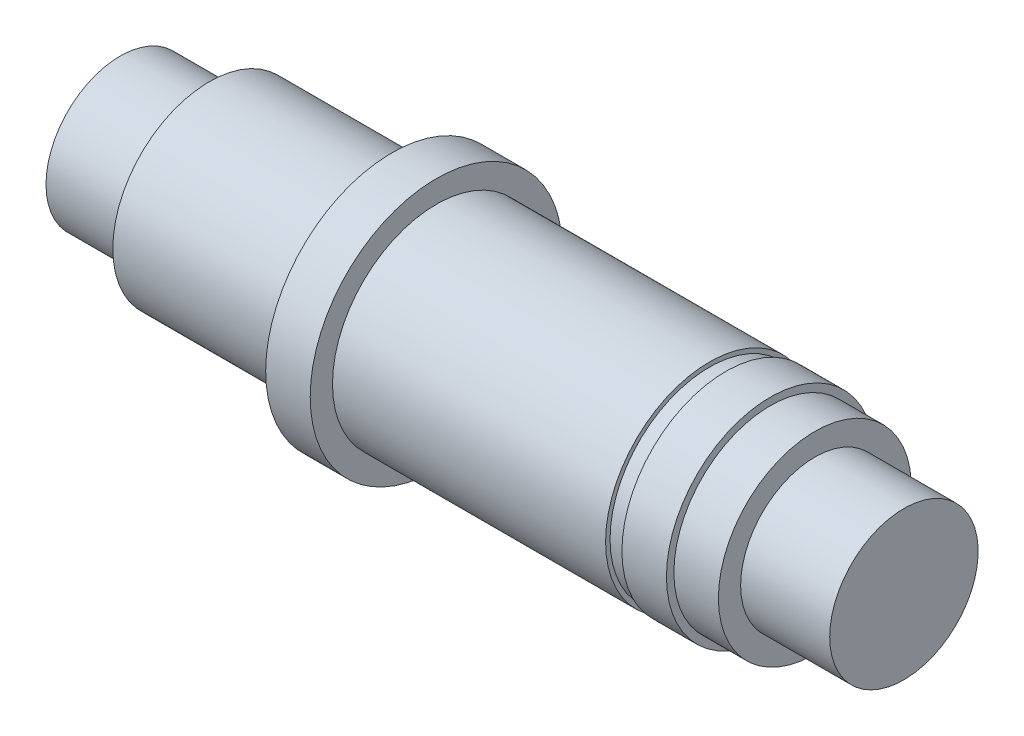
ISO-10303-21;
HEADER;
FILE_DESCRIPTION(('STEP AP214'),'2;1');
FILE_NAME('part.step','',(''),(''),'','','');
FILE_SCHEMA(('AUTOMOTIVE_DESIGN { 1 0 10303 214 1 1 1 1 }'));
ENDSEC;
DATA;
#1=APPLICATION_CONTEXT('core data for automotive mechanical design processes');
#2=APPLICATION_PROTOCOL_DEFINITION('international standard','automotive_design',2000,#1);
#3=PRODUCT_CONTEXT('',#1,'mechanical');
#4=PRODUCT('Part','Part','',(#3));
#5=PRODUCT_RELATED_PRODUCT_CATEGORY('part','',(#4));
#6=PRODUCT_DEFINITION_FORMATION('','',#4);
#7=PRODUCT_DEFINITION_CONTEXT('part definition',#1,'design');
#8=PRODUCT_DEFINITION('design','',#6,#7);
#9=PRODUCT_DEFINITION_SHAPE('','',#8);
#10=(LENGTH_UNIT() NAMED_UNIT(*) SI_UNIT(.MILLI.,.METRE.));
#11=(NAMED_UNIT(*) PLANE_ANGLE_UNIT() SI_UNIT($,.RADIAN.));
#12=(NAMED_UNIT(*) SI_UNIT($,.STERADIAN.) SOLID_ANGLE_UNIT());
#13=UNCERTAINTY_MEASURE_WITH_UNIT(LENGTH_MEASURE(1.E-05),#10,'distance_accuracy_value','');
#14=(GEOMETRIC_REPRESENTATION_CONTEXT(3) GLOBAL_UNCERTAINTY_ASSIGNED_CONTEXT((#13)) GLOBAL_UNIT_ASSIGNED_CONTEXT((#10,
#11,#12)) REPRESENTATION_CONTEXT('',''));
#15=CARTESIAN_POINT('',(0.,0.,0.));
#16=DIRECTION('',(0.,0.,1.));
#17=DIRECTION('',(1.,0.,0.));
#18=AXIS2_PLACEMENT_3D('',#15,#16,#17);
#19=CARTESIAN_POINT('',(46.8,0.,0.));
#20=DIRECTION('',(1.,0.,0.));
#21=DIRECTION('',(0.,0.,-1.));
#22=AXIS2_PLACEMENT_3D('',#19,#20,#21);
#23=PLANE('',#22);
#24=CARTESIAN_POINT('',(46.8,0.,0.));
#25=DIRECTION('',(-1.,0.,0.));
#26=DIRECTION('',(0.,0.,1.));
#27=AXIS2_PLACEMENT_3D('',#24,#25,#26);
#28=CIRCLE('',#27,5.);
#29=CARTESIAN_POINT('',(46.8,0.,5.));
#30=VERTEX_POINT('',#29);
#31=EDGE_CURVE('E98',#30,#30,#28,.T.);
#32=ORIENTED_EDGE('',*,*,#31,.T.);
#33=EDGE_LOOP('',(#32));
#34=FACE_BOUND('',#33,.T.);
#35=CARTESIAN_POINT('',(46.8,0.,0.));
#36=DIRECTION('',(-1.,0.,0.));
#37=DIRECTION('',(0.,0.,1.));
#38=AXIS2_PLACEMENT_3D('',#35,#36,#37);
#39=CIRCLE('',#38,6.5);
#40=CARTESIAN_POINT('',(46.8,0.,6.5));
#41=VERTEX_POINT('',#40);
#42=EDGE_CURVE('E12',#41,#41,#39,.T.);
#43=ORIENTED_EDGE('',*,*,#42,.F.);
#44=EDGE_LOOP('',(#43));
#45=FACE_BOUND('',#44,.T.);
#46=ADVANCED_FACE('F46',(#34,#45),#23,.T.);
#47=CARTESIAN_POINT('',(-13.6685201218921,0.,0.));
#48=DIRECTION('',(-1.,0.,0.));
#49=DIRECTION('',(0.,0.,1.));
#50=AXIS2_PLACEMENT_3D('',#47,#48,#49);
#51=CYLINDRICAL_SURFACE('',#50,6.5);
#52=ORIENTED_EDGE('',*,*,#42,.T.);
#53=EDGE_LOOP('',(#52));
#54=FACE_BOUND('',#53,.T.);
#55=CARTESIAN_POINT('',(43.8,0.,0.));
#56=DIRECTION('',(-1.,0.,0.));
#57=DIRECTION('',(0.,0.,1.));
#58=AXIS2_PLACEMENT_3D('',#55,#56,#57);
#59=CIRCLE('',#58,6.5);
#60=CARTESIAN_POINT('',(43.8,0.,6.5));
#61=VERTEX_POINT('',#60);
#62=EDGE_CURVE('E52',#61,#61,#59,.T.);
#63=ORIENTED_EDGE('',*,*,#62,.F.);
#64=EDGE_LOOP('',(#63));
#65=FACE_BOUND('',#64,.T.);
#66=ADVANCED_FACE('F116',(#54,#65),#51,.T.);
#67=CARTESIAN_POINT('',(43.8,0.,0.));
#68=DIRECTION('',(1.,0.,0.));
#69=DIRECTION('',(0.,0.,-1.));
#70=AXIS2_PLACEMENT_3D('',#67,#68,#69);
#71=PLANE('',#70);
#72=ORIENTED_EDGE('',*,*,#62,.T.);
#73=EDGE_LOOP('',(#72));
#74=FACE_BOUND('',#73,.T.);
#75=CARTESIAN_POINT('',(43.8,0.,0.));
#76=DIRECTION('',(-1.,0.,0.));
#77=DIRECTION('',(0.,0.,1.));
#78=AXIS2_PLACEMENT_3D('',#75,#76,#77);
#79=CIRCLE('',#78,7.);
#80=CARTESIAN_POINT('',(43.8,0.,7.));
#81=VERTEX_POINT('',#80);
#82=EDGE_CURVE('E56',#81,#81,#79,.T.);
#83=ORIENTED_EDGE('',*,*,#82,.F.);
#84=EDGE_LOOP('',(#83));
#85=FACE_BOUND('',#84,.T.);
#86=ADVANCED_FACE('F120',(#74,#85),#71,.T.);
#87=CARTESIAN_POINT('',(-13.6685201218921,0.,0.));
#88=DIRECTION('',(-1.,0.,0.));
#89=DIRECTION('',(0.,0.,1.));
#90=AXIS2_PLACEMENT_3D('',#87,#88,#89);
#91=CYLINDRICAL_SURFACE('',#90,7.);
#92=ORIENTED_EDGE('',*,*,#82,.T.);
#93=EDGE_LOOP('',(#92));
#94=FACE_BOUND('',#93,.T.);
#95=CARTESIAN_POINT('',(40.8,0.,0.));
#96=DIRECTION('',(-1.,0.,0.));
#97=DIRECTION('',(0.,0.,1.));
#98=AXIS2_PLACEMENT_3D('',#95,#96,#97);
#99=CIRCLE('',#98,7.);
#100=CARTESIAN_POINT('',(40.8,0.,7.));
#101=VERTEX_POINT('',#100);
#102=EDGE_CURVE('E60',#101,#101,#99,.T.);
#103=ORIENTED_EDGE('',*,*,#102,.F.);
#104=EDGE_LOOP('',(#103));
#105=FACE_BOUND('',#104,.T.);
#106=ADVANCED_FACE('F124',(#94,#105),#91,.T.);
#107=CARTESIAN_POINT('',(40.8,9.43689570931387E-13,0.));
#108=DIRECTION('',(-1.,0.,0.));
#109=DIRECTION('',(0.,0.,1.));
#110=AXIS2_PLACEMENT_3D('',#107,#108,#109);
#111=PLANE('',#110);
#112=ORIENTED_EDGE('',*,*,#102,.T.);
#113=EDGE_LOOP('',(#112));
#114=FACE_BOUND('',#113,.T.);
#115=CARTESIAN_POINT('',(40.8,0.,0.));
#116=DIRECTION('',(-1.,0.,0.));
#117=DIRECTION('',(0.,0.,1.));
#118=AXIS2_PLACEMENT_3D('',#115,#116,#117);
#119=CIRCLE('',#118,6.7);
#120=CARTESIAN_POINT('',(40.8,0.,6.7));
#121=VERTEX_POINT('',#120);
#122=EDGE_CURVE('E65',#121,#121,#119,.T.);
#123=ORIENTED_EDGE('',*,*,#122,.F.);
#124=EDGE_LOOP('',(#123));
#125=FACE_BOUND('',#124,.T.);
#126=ADVANCED_FACE('F130',(#114,#125),#111,.T.);
#127=CARTESIAN_POINT('',(-13.6685201218921,0.,0.));
#128=DIRECTION('',(-1.,0.,0.));
#129=DIRECTION('',(0.,0.,1.));
#130=AXIS2_PLACEMENT_3D('',#127,#128,#129);
#131=CYLINDRICAL_SURFACE('',#130,6.7);
#132=ORIENTED_EDGE('',*,*,#122,.T.);
#133=EDGE_LOOP('',(#132));
#134=FACE_BOUND('',#133,.T.);
#135=CARTESIAN_POINT('',(39.7,0.,0.));
#136=DIRECTION('',(-1.,0.,0.));
#137=DIRECTION('',(0.,0.,1.));
#138=AXIS2_PLACEMENT_3D('',#135,#136,#137);
#139=CIRCLE('',#138,6.7);
#140=CARTESIAN_POINT('',(39.7,0.,6.7));
#141=VERTEX_POINT('',#140);
#142=EDGE_CURVE('E68',#141,#141,#139,.T.);
#143=ORIENTED_EDGE('',*,*,#142,.F.);
#144=EDGE_LOOP('',(#143));
#145=FACE_BOUND('',#144,.T.);
#146=ADVANCED_FACE('F134',(#134,#145),#131,.T.);
#147=CARTESIAN_POINT('',(39.7,0.,0.));
#148=DIRECTION('',(1.,0.,0.));
#149=DIRECTION('',(0.,0.,-1.));
#150=AXIS2_PLACEMENT_3D('',#147,#148,#149);
#151=PLANE('',#150);
#152=ORIENTED_EDGE('',*,*,#142,.T.);
#153=EDGE_LOOP('',(#152));
#154=FACE_BOUND('',#153,.T.);
#155=CARTESIAN_POINT('',(39.7,0.,0.));
#156=DIRECTION('',(-1.,0.,0.));
#157=DIRECTION('',(0.,0.,1.));
#158=AXIS2_PLACEMENT_3D('',#155,#156,#157);
#159=CIRCLE('',#158,7.);
#160=CARTESIAN_POINT('',(39.7,0.,7.));
#161=VERTEX_POINT('',#160);
#162=EDGE_CURVE('E71',#161,#161,#159,.T.);
#163=ORIENTED_EDGE('',*,*,#162,.F.);
#164=EDGE_LOOP('',(#163));
#165=FACE_BOUND('',#164,.T.);
#166=ADVANCED_FACE('F138',(#154,#165),#151,.T.);
#167=CARTESIAN_POINT('',(-13.6685201218921,0.,0.));
#168=DIRECTION('',(-1.,0.,0.));
#169=DIRECTION('',(0.,0.,1.));
#170=AXIS2_PLACEMENT_3D('',#167,#168,#169);
#171=CYLINDRICAL_SURFACE('',#170,7.);
#172=ORIENTED_EDGE('',*,*,#162,.T.);
#173=EDGE_LOOP('',(#172));
#174=FACE_BOUND('',#173,.T.);
#175=CARTESIAN_POINT('',(21.3,0.,0.));
#176=DIRECTION('',(-1.,0.,0.));
#177=DIRECTION('',(0.,0.,1.));
#178=AXIS2_PLACEMENT_3D('',#175,#176,#177);
#179=CIRCLE('',#178,7.);
#180=CARTESIAN_POINT('',(21.3,0.,7.));
#181=VERTEX_POINT('',#180);
#182=EDGE_CURVE('E74',#181,#181,#179,.T.);
#183=ORIENTED_EDGE('',*,*,#182,.F.);
#184=EDGE_LOOP('',(#183));
#185=FACE_BOUND('',#184,.T.);
#186=ADVANCED_FACE('F142',(#174,#185),#171,.T.);
#187=CARTESIAN_POINT('',(21.3,0.,0.));
#188=DIRECTION('',(1.,0.,0.));
#189=DIRECTION('',(0.,0.,-1.));
#190=AXIS2_PLACEMENT_3D('',#187,#188,#189);
#191=PLANE('',#190);
#192=ORIENTED_EDGE('',*,*,#182,.T.);
#193=EDGE_LOOP('',(#192));
#194=FACE_BOUND('',#193,.T.);
#195=CARTESIAN_POINT('',(21.3,0.,0.));
#196=DIRECTION('',(-1.,0.,0.));
#197=DIRECTION('',(0.,0.,1.));
#198=AXIS2_PLACEMENT_3D('',#195,#196,#197);
#199=CIRCLE('',#198,8.5);
#200=CARTESIAN_POINT('',(21.3,0.,8.5));
#201=VERTEX_POINT('',#200);
#202=EDGE_CURVE('E77',#201,#201,#199,.T.);
#203=ORIENTED_EDGE('',*,*,#202,.F.);
#204=EDGE_LOOP('',(#203));
#205=FACE_BOUND('',#204,.T.);
#206=ADVANCED_FACE('F146',(#194,#205),#191,.T.);
#207=CARTESIAN_POINT('',(-13.6685201218921,0.,0.));
#208=DIRECTION('',(-1.,0.,0.));
#209=DIRECTION('',(0.,0.,1.));
#210=AXIS2_PLACEMENT_3D('',#207,#208,#209);
#211=CYLINDRICAL_SURFACE('',#210,8.5);
#212=ORIENTED_EDGE('',*,*,#202,.T.);
#213=EDGE_LOOP('',(#212));
#214=FACE_BOUND('',#213,.T.);
#215=CARTESIAN_POINT('',(18.3,0.,0.));
#216=DIRECTION('',(-1.,0.,0.));
#217=DIRECTION('',(0.,0.,1.));
#218=AXIS2_PLACEMENT_3D('',#215,#216,#217);
#219=CIRCLE('',#218,8.5);
#220=CARTESIAN_POINT('',(18.3,0.,8.5));
#221=VERTEX_POINT('',#220);
#222=EDGE_CURVE('E80',#221,#221,#219,.T.);
#223=ORIENTED_EDGE('',*,*,#222,.F.);
#224=EDGE_LOOP('',(#223));
#225=FACE_BOUND('',#224,.T.);
#226=ADVANCED_FACE('F150',(#214,#225),#211,.T.);
#227=CARTESIAN_POINT('',(18.3,0.,0.));
#228=DIRECTION('',(-1.,0.,0.));
#229=DIRECTION('',(0.,0.,1.));
#230=AXIS2_PLACEMENT_3D('',#227,#228,#229);
#231=PLANE('',#230);
#232=ORIENTED_EDGE('',*,*,#222,.T.);
#233=EDGE_LOOP('',(#232));
#234=FACE_BOUND('',#233,.T.);
#235=CARTESIAN_POINT('',(18.3,0.,0.));
#236=DIRECTION('',(-1.,0.,0.));
#237=DIRECTION('',(0.,0.,1.));
#238=AXIS2_PLACEMENT_3D('',#235,#236,#237);
#239=CIRCLE('',#238,6.5);
#240=CARTESIAN_POINT('',(18.3,0.,6.5));
#241=VERTEX_POINT('',#240);
#242=EDGE_CURVE('E83',#241,#241,#239,.T.);
#243=ORIENTED_EDGE('',*,*,#242,.F.);
#244=EDGE_LOOP('',(#243));
#245=FACE_BOUND('',#244,.T.);
#246=ADVANCED_FACE('F154',(#234,#245),#231,.T.);
#247=CARTESIAN_POINT('',(-13.6685201218921,0.,0.));
#248=DIRECTION('',(-1.,0.,0.));
#249=DIRECTION('',(0.,0.,1.));
#250=AXIS2_PLACEMENT_3D('',#247,#248,#249);
#251=CYLINDRICAL_SURFACE('',#250,6.5);
#252=ORIENTED_EDGE('',*,*,#242,.T.);
#253=EDGE_LOOP('',(#252));
#254=FACE_BOUND('',#253,.T.);
#255=CARTESIAN_POINT('',(6.,0.,0.));
#256=DIRECTION('',(-1.,0.,0.));
#257=DIRECTION('',(0.,0.,1.));
#258=AXIS2_PLACEMENT_3D('',#255,#256,#257);
#259=CIRCLE('',#258,6.5);
#260=CARTESIAN_POINT('',(6.,0.,6.5));
#261=VERTEX_POINT('',#260);
#262=EDGE_CURVE('E86',#261,#261,#259,.T.);
#263=ORIENTED_EDGE('',*,*,#262,.F.);
#264=EDGE_LOOP('',(#263));
#265=FACE_BOUND('',#264,.T.);
#266=ADVANCED_FACE('F158',(#254,#265),#251,.T.);
#267=CARTESIAN_POINT('',(6.,0.,0.));
#268=DIRECTION('',(-1.,0.,0.));
#269=DIRECTION('',(0.,0.,1.));
#270=AXIS2_PLACEMENT_3D('',#267,#268,#269);
#271=PLANE('',#270);
#272=ORIENTED_EDGE('',*,*,#262,.T.);
#273=EDGE_LOOP('',(#272));
#274=FACE_BOUND('',#273,.T.);
#275=CARTESIAN_POINT('',(6.,0.,0.));
#276=DIRECTION('',(-1.,0.,0.));
#277=DIRECTION('',(0.,0.,1.));
#278=AXIS2_PLACEMENT_3D('',#275,#276,#277);
#279=CIRCLE('',#278,5.);
#280=CARTESIAN_POINT('',(6.,0.,5.));
#281=VERTEX_POINT('',#280);
#282=EDGE_CURVE('E89',#281,#281,#279,.T.);
#283=ORIENTED_EDGE('',*,*,#282,.F.);
#284=EDGE_LOOP('',(#283));
#285=FACE_BOUND('',#284,.T.);
#286=ADVANCED_FACE('F162',(#274,#285),#271,.T.);
#287=CARTESIAN_POINT('',(-13.6685201218921,0.,0.));
#288=DIRECTION('',(-1.,0.,0.));
#289=DIRECTION('',(0.,0.,1.));
#290=AXIS2_PLACEMENT_3D('',#287,#288,#289);
#291=CYLINDRICAL_SURFACE('',#290,5.);
#292=ORIENTED_EDGE('',*,*,#282,.T.);
#293=EDGE_LOOP('',(#292));
#294=FACE_BOUND('',#293,.T.);
#295=CARTESIAN_POINT('',(0.,0.,0.));
#296=DIRECTION('',(-1.,0.,0.));
#297=DIRECTION('',(0.,0.,1.));
#298=AXIS2_PLACEMENT_3D('',#295,#296,#297);
#299=CIRCLE('',#298,5.);
#300=CARTESIAN_POINT('',(0.,0.,5.));
#301=VERTEX_POINT('',#300);
#302=EDGE_CURVE('E92',#301,#301,#299,.T.);
#303=ORIENTED_EDGE('',*,*,#302,.F.);
#304=EDGE_LOOP('',(#303));
#305=FACE_BOUND('',#304,.T.);
#306=ADVANCED_FACE('F166',(#294,#305),#291,.T.);
#307=CARTESIAN_POINT('',(0.,0.,0.));
#308=DIRECTION('',(-1.,0.,0.));
#309=DIRECTION('',(0.,0.,1.));
#310=AXIS2_PLACEMENT_3D('',#307,#308,#309);
#311=PLANE('',#310);
#312=ORIENTED_EDGE('',*,*,#302,.T.);
#313=EDGE_LOOP('',(#312));
#314=FACE_BOUND('',#313,.T.);
#315=ADVANCED_FACE('F112',(#314),#311,.T.);
#316=CARTESIAN_POINT('',(52.8,0.,0.));
#317=DIRECTION('',(1.,0.,0.));
#318=DIRECTION('',(0.,0.,-1.));
#319=AXIS2_PLACEMENT_3D('',#316,#317,#318);
#320=PLANE('',#319);
#321=CARTESIAN_POINT('',(52.8,0.,0.));
#322=DIRECTION('',(-1.,0.,0.));
#323=DIRECTION('',(0.,0.,1.));
#324=AXIS2_PLACEMENT_3D('',#321,#322,#323);
#325=CIRCLE('',#324,5.);
#326=CARTESIAN_POINT('',(52.8,0.,5.));
#327=VERTEX_POINT('',#326);
#328=EDGE_CURVE('E95',#327,#327,#325,.T.);
#329=ORIENTED_EDGE('',*,*,#328,.F.);
#330=EDGE_LOOP('',(#329));
#331=FACE_BOUND('',#330,.T.);
#332=ADVANCED_FACE('F106',(#331),#320,.T.);
#333=CARTESIAN_POINT('',(-13.6685201218921,0.,0.));
#334=DIRECTION('',(-1.,0.,0.));
#335=DIRECTION('',(0.,0.,1.));
#336=AXIS2_PLACEMENT_3D('',#333,#334,#335);
#337=CYLINDRICAL_SURFACE('',#336,5.);
#338=ORIENTED_EDGE('',*,*,#328,.T.);
#339=EDGE_LOOP('',(#338));
#340=FACE_BOUND('',#339,.T.);
#341=ORIENTED_EDGE('',*,*,#31,.F.);
#342=EDGE_LOOP('',(#341));
#343=FACE_BOUND('',#342,.T.);
#344=ADVANCED_FACE('F104',(#340,#343),#337,.T.);
#345=CLOSED_SHELL('',(#46,#66,#86,#106,#126,#146,#166,#186,#206,#226,#246,#266,#286,#306,#315,
#332,#344));
#346=MANIFOLD_SOLID_BREP('B2',#345);
#347=ADVANCED_BREP_SHAPE_REPRESENTATION('',(#18,#346),#14);
#348=SHAPE_DEFINITION_REPRESENTATION(#9,#347);
ENDSEC;
END-ISO-10303-21;
